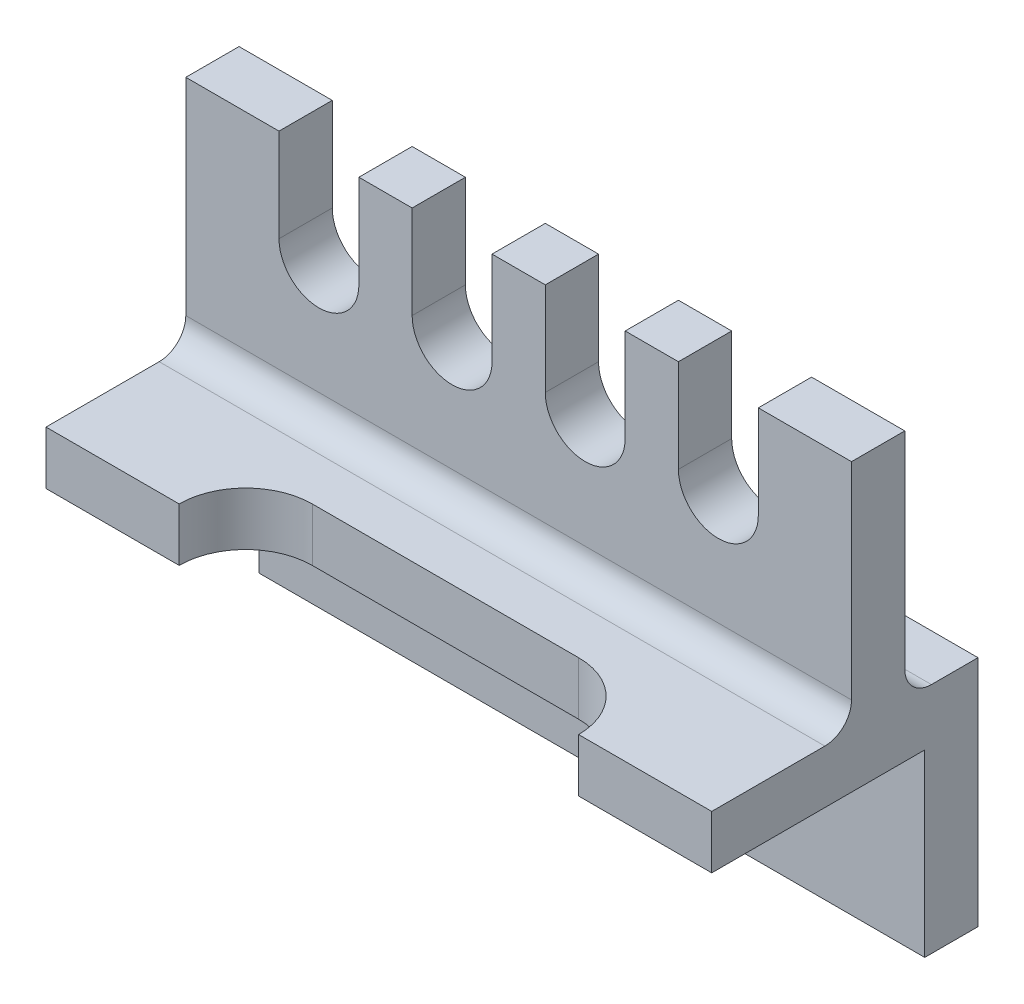
ISO-10303-21;
HEADER;
FILE_DESCRIPTION(('STEP AP214'),'2;1');
FILE_NAME('part.step','',(''),(''),'','','');
FILE_SCHEMA(('AUTOMOTIVE_DESIGN { 1 0 10303 214 1 1 1 1 }'));
ENDSEC;
DATA;
#1=APPLICATION_CONTEXT('core data for automotive mechanical design processes');
#2=APPLICATION_PROTOCOL_DEFINITION('international standard','automotive_design',2000,#1);
#3=PRODUCT_CONTEXT('',#1,'mechanical');
#4=PRODUCT('Part','Part','',(#3));
#5=PRODUCT_RELATED_PRODUCT_CATEGORY('part','',(#4));
#6=PRODUCT_DEFINITION_FORMATION('','',#4);
#7=PRODUCT_DEFINITION_CONTEXT('part definition',#1,'design');
#8=PRODUCT_DEFINITION('design','',#6,#7);
#9=PRODUCT_DEFINITION_SHAPE('','',#8);
#10=(LENGTH_UNIT() NAMED_UNIT(*) SI_UNIT(.MILLI.,.METRE.));
#11=(NAMED_UNIT(*) PLANE_ANGLE_UNIT() SI_UNIT($,.RADIAN.));
#12=(NAMED_UNIT(*) SI_UNIT($,.STERADIAN.) SOLID_ANGLE_UNIT());
#13=UNCERTAINTY_MEASURE_WITH_UNIT(LENGTH_MEASURE(1.E-05),#10,'distance_accuracy_value','');
#14=(GEOMETRIC_REPRESENTATION_CONTEXT(3) GLOBAL_UNCERTAINTY_ASSIGNED_CONTEXT((#13)) GLOBAL_UNIT_ASSIGNED_CONTEXT((#10,
#11,#12)) REPRESENTATION_CONTEXT('',''));
#15=CARTESIAN_POINT('',(0.,0.,0.));
#16=DIRECTION('',(0.,0.,1.));
#17=DIRECTION('',(1.,0.,0.));
#18=AXIS2_PLACEMENT_3D('',#15,#16,#17);
#19=CARTESIAN_POINT('',(100.,27.,40.));
#20=DIRECTION('',(0.,0.,-1.));
#21=DIRECTION('',(-1.,0.,0.));
#22=AXIS2_PLACEMENT_3D('',#19,#20,#21);
#23=PLANE('',#22);
#24=DIRECTION('',(-1.,0.,0.));
#25=VECTOR('',#24,1.);
#26=CARTESIAN_POINT('',(100.,27.,40.));
#27=LINE('',#26,#25);
#28=CARTESIAN_POINT('',(20.,27.,40.));
#29=VERTEX_POINT('',#28);
#30=CARTESIAN_POINT('',(0.,27.,40.));
#31=VERTEX_POINT('',#30);
#32=EDGE_CURVE('E256',#29,#31,#27,.T.);
#33=ORIENTED_EDGE('',*,*,#32,.F.);
#34=DIRECTION('',(0.,1.,0.));
#35=VECTOR('',#34,1.);
#36=CARTESIAN_POINT('',(20.,-0.00100000000004957,40.));
#37=LINE('',#36,#35);
#38=CARTESIAN_POINT('',(20.,35.,40.));
#39=VERTEX_POINT('',#38);
#40=EDGE_CURVE('E242',#29,#39,#37,.T.);
#41=ORIENTED_EDGE('',*,*,#40,.T.);
#42=DIRECTION('',(-1.,0.,0.));
#43=VECTOR('',#42,1.);
#44=CARTESIAN_POINT('',(100.,35.,40.));
#45=LINE('',#44,#43);
#46=CARTESIAN_POINT('',(0.,35.,40.));
#47=VERTEX_POINT('',#46);
#48=EDGE_CURVE('E267',#39,#47,#45,.T.);
#49=ORIENTED_EDGE('',*,*,#48,.T.);
#50=DIRECTION('',(0.,-1.,0.));
#51=VECTOR('',#50,1.);
#52=CARTESIAN_POINT('',(0.,27.,40.));
#53=LINE('',#52,#51);
#54=EDGE_CURVE('E261',#47,#31,#53,.T.);
#55=ORIENTED_EDGE('',*,*,#54,.T.);
#56=EDGE_LOOP('',(#33,#41,#49,#55));
#57=FACE_BOUND('',#56,.T.);
#58=ADVANCED_FACE('F33',(#57),#23,.F.);
#59=CARTESIAN_POINT('',(100.,70.,19.));
#60=DIRECTION('',(0.,-1.,0.));
#61=DIRECTION('',(0.,0.,-1.));
#62=AXIS2_PLACEMENT_3D('',#59,#60,#61);
#63=PLANE('',#62);
#64=DIRECTION('',(-1.,0.,0.));
#65=VECTOR('',#64,1.);
#66=CARTESIAN_POINT('',(100.,70.,19.));
#67=LINE('',#66,#65);
#68=CARTESIAN_POINT('',(74.,70.,19.));
#69=VERTEX_POINT('',#68);
#70=CARTESIAN_POINT('',(66.,70.,19.));
#71=VERTEX_POINT('',#70);
#72=EDGE_CURVE('E319',#69,#71,#67,.T.);
#73=ORIENTED_EDGE('',*,*,#72,.F.);
#74=DIRECTION('',(0.,0.,1.));
#75=VECTOR('',#74,1.);
#76=CARTESIAN_POINT('',(74.,70.,-0.001000000000001));
#77=LINE('',#76,#75);
#78=CARTESIAN_POINT('',(74.,70.,11.));
#79=VERTEX_POINT('',#78);
#80=EDGE_CURVE('E482',#79,#69,#77,.T.);
#81=ORIENTED_EDGE('',*,*,#80,.F.);
#82=DIRECTION('',(-1.,0.,0.));
#83=VECTOR('',#82,1.);
#84=CARTESIAN_POINT('',(100.,70.,11.));
#85=LINE('',#84,#83);
#86=CARTESIAN_POINT('',(66.,70.,11.));
#87=VERTEX_POINT('',#86);
#88=EDGE_CURVE('E325',#79,#87,#85,.T.);
#89=ORIENTED_EDGE('',*,*,#88,.T.);
#90=DIRECTION('',(0.,0.,1.));
#91=VECTOR('',#90,1.);
#92=CARTESIAN_POINT('',(66.,70.,-0.001000000000001));
#93=LINE('',#92,#91);
#94=EDGE_CURVE('E460',#87,#71,#93,.T.);
#95=ORIENTED_EDGE('',*,*,#94,.T.);
#96=EDGE_LOOP('',(#73,#81,#89,#95));
#97=FACE_BOUND('',#96,.T.);
#98=ADVANCED_FACE('F558',(#97),#63,.F.);
#99=CARTESIAN_POINT('',(54.,70.,19.));
#100=VERTEX_POINT('',#99);
#101=CARTESIAN_POINT('',(46.,70.,19.));
#102=VERTEX_POINT('',#101);
#103=EDGE_CURVE('E516',#100,#102,#67,.T.);
#104=ORIENTED_EDGE('',*,*,#103,.F.);
#105=DIRECTION('',(0.,0.,1.));
#106=VECTOR('',#105,1.);
#107=CARTESIAN_POINT('',(54.,70.,-0.001000000000001));
#108=LINE('',#107,#106);
#109=CARTESIAN_POINT('',(54.,70.,11.));
#110=VERTEX_POINT('',#109);
#111=EDGE_CURVE('E458',#110,#100,#108,.T.);
#112=ORIENTED_EDGE('',*,*,#111,.F.);
#113=CARTESIAN_POINT('',(46.,70.,11.));
#114=VERTEX_POINT('',#113);
#115=EDGE_CURVE('E847',#110,#114,#85,.T.);
#116=ORIENTED_EDGE('',*,*,#115,.T.);
#117=DIRECTION('',(0.,0.,1.));
#118=VECTOR('',#117,1.);
#119=CARTESIAN_POINT('',(46.,70.,-0.001000000000001));
#120=LINE('',#119,#118);
#121=EDGE_CURVE('E502',#114,#102,#120,.T.);
#122=ORIENTED_EDGE('',*,*,#121,.T.);
#123=EDGE_LOOP('',(#104,#112,#116,#122));
#124=FACE_BOUND('',#123,.T.);
#125=ADVANCED_FACE('F563',(#124),#63,.F.);
#126=CARTESIAN_POINT('',(14.,70.,19.));
#127=VERTEX_POINT('',#126);
#128=CARTESIAN_POINT('',(0.,70.,19.));
#129=VERTEX_POINT('',#128);
#130=EDGE_CURVE('E320',#127,#129,#67,.T.);
#131=ORIENTED_EDGE('',*,*,#130,.F.);
#132=DIRECTION('',(0.,0.,1.));
#133=VECTOR('',#132,1.);
#134=CARTESIAN_POINT('',(14.,70.,-0.001000000000001));
#135=LINE('',#134,#133);
#136=CARTESIAN_POINT('',(14.,70.,11.));
#137=VERTEX_POINT('',#136);
#138=EDGE_CURVE('E433',#137,#127,#135,.T.);
#139=ORIENTED_EDGE('',*,*,#138,.F.);
#140=CARTESIAN_POINT('',(0.,70.,11.));
#141=VERTEX_POINT('',#140);
#142=EDGE_CURVE('E318',#137,#141,#85,.T.);
#143=ORIENTED_EDGE('',*,*,#142,.T.);
#144=DIRECTION('',(0.,0.,1.));
#145=VECTOR('',#144,1.);
#146=CARTESIAN_POINT('',(0.,70.,19.));
#147=LINE('',#146,#145);
#148=EDGE_CURVE('E311',#141,#129,#147,.T.);
#149=ORIENTED_EDGE('',*,*,#148,.T.);
#150=EDGE_LOOP('',(#131,#139,#143,#149));
#151=FACE_BOUND('',#150,.T.);
#152=ADVANCED_FACE('F529',(#151),#63,.F.);
#153=CARTESIAN_POINT('',(34.,70.,11.));
#154=VERTEX_POINT('',#153);
#155=CARTESIAN_POINT('',(26.,70.,11.));
#156=VERTEX_POINT('',#155);
#157=EDGE_CURVE('E844',#154,#156,#85,.T.);
#158=ORIENTED_EDGE('',*,*,#157,.T.);
#159=DIRECTION('',(0.,0.,1.));
#160=VECTOR('',#159,1.);
#161=CARTESIAN_POINT('',(26.,70.,-0.001000000000001));
#162=LINE('',#161,#160);
#163=CARTESIAN_POINT('',(26.,70.,19.));
#164=VERTEX_POINT('',#163);
#165=EDGE_CURVE('E435',#156,#164,#162,.T.);
#166=ORIENTED_EDGE('',*,*,#165,.T.);
#167=CARTESIAN_POINT('',(34.,70.,19.));
#168=VERTEX_POINT('',#167);
#169=EDGE_CURVE('E519',#168,#164,#67,.T.);
#170=ORIENTED_EDGE('',*,*,#169,.F.);
#171=DIRECTION('',(0.,0.,1.));
#172=VECTOR('',#171,1.);
#173=CARTESIAN_POINT('',(34.,70.,-0.001000000000001));
#174=LINE('',#173,#172);
#175=EDGE_CURVE('E381',#154,#168,#174,.T.);
#176=ORIENTED_EDGE('',*,*,#175,.F.);
#177=EDGE_LOOP('',(#158,#166,#170,#176));
#178=FACE_BOUND('',#177,.T.);
#179=ADVANCED_FACE('F556',(#178),#63,.F.);
#180=CARTESIAN_POINT('',(100.,70.,19.));
#181=DIRECTION('',(0.,0.,-1.));
#182=DIRECTION('',(0.,1.,0.));
#183=AXIS2_PLACEMENT_3D('',#180,#181,#182);
#184=PLANE('',#183);
#185=CARTESIAN_POINT('',(80.,56.,19.));
#186=DIRECTION('',(0.,0.,1.));
#187=DIRECTION('',(1.,0.,0.));
#188=AXIS2_PLACEMENT_3D('',#185,#186,#187);
#189=CIRCLE('',#188,5.99999999999999);
#190=CARTESIAN_POINT('',(74.,56.,19.));
#191=VERTEX_POINT('',#190);
#192=CARTESIAN_POINT('',(86.,56.,19.));
#193=VERTEX_POINT('',#192);
#194=EDGE_CURVE('E471',#191,#193,#189,.T.);
#195=ORIENTED_EDGE('',*,*,#194,.F.);
#196=DIRECTION('',(0.,-1.,0.));
#197=VECTOR('',#196,1.);
#198=CARTESIAN_POINT('',(74.,56.,19.));
#199=LINE('',#198,#197);
#200=EDGE_CURVE('E476',#69,#191,#199,.T.);
#201=ORIENTED_EDGE('',*,*,#200,.F.);
#202=ORIENTED_EDGE('',*,*,#72,.T.);
#203=DIRECTION('',(0.,1.,0.));
#204=VECTOR('',#203,1.);
#205=CARTESIAN_POINT('',(66.,56.,19.));
#206=LINE('',#205,#204);
#207=CARTESIAN_POINT('',(66.,56.,19.));
#208=VERTEX_POINT('',#207);
#209=EDGE_CURVE('E450',#208,#71,#206,.T.);
#210=ORIENTED_EDGE('',*,*,#209,.F.);
#211=CARTESIAN_POINT('',(60.,56.,19.));
#212=DIRECTION('',(0.,0.,1.));
#213=DIRECTION('',(1.,0.,0.));
#214=AXIS2_PLACEMENT_3D('',#211,#212,#213);
#215=CIRCLE('',#214,6.);
#216=CARTESIAN_POINT('',(54.,56.,19.));
#217=VERTEX_POINT('',#216);
#218=EDGE_CURVE('E447',#217,#208,#215,.T.);
#219=ORIENTED_EDGE('',*,*,#218,.F.);
#220=DIRECTION('',(0.,-1.,0.));
#221=VECTOR('',#220,1.);
#222=CARTESIAN_POINT('',(54.,56.,19.));
#223=LINE('',#222,#221);
#224=EDGE_CURVE('E452',#100,#217,#223,.T.);
#225=ORIENTED_EDGE('',*,*,#224,.F.);
#226=ORIENTED_EDGE('',*,*,#103,.T.);
#227=DIRECTION('',(0.,1.,0.));
#228=VECTOR('',#227,1.);
#229=CARTESIAN_POINT('',(46.,56.,19.));
#230=LINE('',#229,#228);
#231=CARTESIAN_POINT('',(46.,56.,19.));
#232=VERTEX_POINT('',#231);
#233=EDGE_CURVE('E497',#232,#102,#230,.T.);
#234=ORIENTED_EDGE('',*,*,#233,.F.);
#235=CARTESIAN_POINT('',(40.,56.,19.));
#236=DIRECTION('',(0.,0.,1.));
#237=DIRECTION('',(1.,0.,0.));
#238=AXIS2_PLACEMENT_3D('',#235,#236,#237);
#239=CIRCLE('',#238,6.);
#240=CARTESIAN_POINT('',(34.,56.,19.));
#241=VERTEX_POINT('',#240);
#242=EDGE_CURVE('E494',#241,#232,#239,.T.);
#243=ORIENTED_EDGE('',*,*,#242,.F.);
#244=DIRECTION('',(0.,-1.,0.));
#245=VECTOR('',#244,1.);
#246=CARTESIAN_POINT('',(34.,56.,19.));
#247=LINE('',#246,#245);
#248=EDGE_CURVE('E499',#168,#241,#247,.T.);
#249=ORIENTED_EDGE('',*,*,#248,.F.);
#250=ORIENTED_EDGE('',*,*,#169,.T.);
#251=DIRECTION('',(0.,1.,0.));
#252=VECTOR('',#251,1.);
#253=CARTESIAN_POINT('',(26.,56.,19.));
#254=LINE('',#253,#252);
#255=CARTESIAN_POINT('',(26.,56.,19.));
#256=VERTEX_POINT('',#255);
#257=EDGE_CURVE('E56',#256,#164,#254,.T.);
#258=ORIENTED_EDGE('',*,*,#257,.F.);
#259=CARTESIAN_POINT('',(20.,56.,19.));
#260=DIRECTION('',(0.,0.,1.));
#261=DIRECTION('',(1.,0.,0.));
#262=AXIS2_PLACEMENT_3D('',#259,#260,#261);
#263=CIRCLE('',#262,6.00000000000001);
#264=CARTESIAN_POINT('',(14.,56.,19.));
#265=VERTEX_POINT('',#264);
#266=EDGE_CURVE('E422',#265,#256,#263,.T.);
#267=ORIENTED_EDGE('',*,*,#266,.F.);
#268=DIRECTION('',(0.,-1.,0.));
#269=VECTOR('',#268,1.);
#270=CARTESIAN_POINT('',(14.,56.,19.));
#271=LINE('',#270,#269);
#272=EDGE_CURVE('E426',#127,#265,#271,.T.);
#273=ORIENTED_EDGE('',*,*,#272,.F.);
#274=ORIENTED_EDGE('',*,*,#130,.T.);
#275=DIRECTION('',(0.,-1.,0.));
#276=VECTOR('',#275,1.);
#277=CARTESIAN_POINT('',(0.,70.,19.));
#278=LINE('',#277,#276);
#279=CARTESIAN_POINT('',(0.,39.,19.));
#280=VERTEX_POINT('',#279);
#281=EDGE_CURVE('E293',#129,#280,#278,.T.);
#282=ORIENTED_EDGE('',*,*,#281,.T.);
#283=DIRECTION('',(-1.,0.,0.));
#284=VECTOR('',#283,1.);
#285=CARTESIAN_POINT('',(100.,39.,19.));
#286=LINE('',#285,#284);
#287=CARTESIAN_POINT('',(100.,39.,19.));
#288=VERTEX_POINT('',#287);
#289=EDGE_CURVE('E11',#288,#280,#286,.T.);
#290=ORIENTED_EDGE('',*,*,#289,.F.);
#291=DIRECTION('',(0.,-1.,0.));
#292=VECTOR('',#291,1.);
#293=CARTESIAN_POINT('',(100.,70.,19.));
#294=LINE('',#293,#292);
#295=CARTESIAN_POINT('',(100.,70.,19.));
#296=VERTEX_POINT('',#295);
#297=EDGE_CURVE('E314',#296,#288,#294,.T.);
#298=ORIENTED_EDGE('',*,*,#297,.F.);
#299=CARTESIAN_POINT('',(86.,70.,19.));
#300=VERTEX_POINT('',#299);
#301=EDGE_CURVE('E315',#296,#300,#67,.T.);
#302=ORIENTED_EDGE('',*,*,#301,.T.);
#303=DIRECTION('',(0.,1.,0.));
#304=VECTOR('',#303,1.);
#305=CARTESIAN_POINT('',(86.,56.,19.));
#306=LINE('',#305,#304);
#307=EDGE_CURVE('E474',#193,#300,#306,.T.);
#308=ORIENTED_EDGE('',*,*,#307,.F.);
#309=EDGE_LOOP('',(#195,#201,#202,#210,#219,#225,#226,#234,#243,#249,#250,#258,#267,#273,#274,
#282,#290,#298,#302,#308));
#310=FACE_BOUND('',#309,.T.);
#311=ADVANCED_FACE('F35',(#310),#184,.F.);
#312=CARTESIAN_POINT('',(100.,39.,23.));
#313=DIRECTION('',(-1.,0.,0.));
#314=DIRECTION('',(0.,0.,1.));
#315=AXIS2_PLACEMENT_3D('',#312,#313,#314);
#316=CYLINDRICAL_SURFACE('',#315,4.);
#317=CARTESIAN_POINT('',(0.,39.,23.));
#318=DIRECTION('',(-1.,0.,0.));
#319=DIRECTION('',(0.,0.,-1.));
#320=AXIS2_PLACEMENT_3D('',#317,#318,#319);
#321=CIRCLE('',#320,4.);
#322=CARTESIAN_POINT('',(0.,35.,23.));
#323=VERTEX_POINT('',#322);
#324=EDGE_CURVE('E289',#280,#323,#321,.T.);
#325=ORIENTED_EDGE('',*,*,#324,.T.);
#326=DIRECTION('',(-1.,0.,0.));
#327=VECTOR('',#326,1.);
#328=CARTESIAN_POINT('',(100.,35.,23.));
#329=LINE('',#328,#327);
#330=CARTESIAN_POINT('',(100.,35.,23.));
#331=VERTEX_POINT('',#330);
#332=EDGE_CURVE('E41',#331,#323,#329,.T.);
#333=ORIENTED_EDGE('',*,*,#332,.F.);
#334=CARTESIAN_POINT('',(100.,39.,23.));
#335=DIRECTION('',(-1.,0.,0.));
#336=DIRECTION('',(0.,0.,-1.));
#337=AXIS2_PLACEMENT_3D('',#334,#335,#336);
#338=CIRCLE('',#337,4.);
#339=EDGE_CURVE('E389',#288,#331,#338,.T.);
#340=ORIENTED_EDGE('',*,*,#339,.F.);
#341=ORIENTED_EDGE('',*,*,#289,.T.);
#342=EDGE_LOOP('',(#325,#333,#340,#341));
#343=FACE_BOUND('',#342,.T.);
#344=ADVANCED_FACE('F549',(#343),#316,.F.);
#345=CARTESIAN_POINT('',(100.,35.,40.));
#346=DIRECTION('',(0.,-1.,0.));
#347=DIRECTION('',(0.,0.,-1.));
#348=AXIS2_PLACEMENT_3D('',#345,#346,#347);
#349=PLANE('',#348);
#350=ORIENTED_EDGE('',*,*,#48,.F.);
#351=CARTESIAN_POINT('',(30.,35.,40.));
#352=DIRECTION('',(0.,1.,0.));
#353=DIRECTION('',(0.,0.,1.));
#354=AXIS2_PLACEMENT_3D('',#351,#352,#353);
#355=CIRCLE('',#354,10.);
#356=CARTESIAN_POINT('',(30.,35.,30.));
#357=VERTEX_POINT('',#356);
#358=EDGE_CURVE('E247',#357,#39,#355,.T.);
#359=ORIENTED_EDGE('',*,*,#358,.F.);
#360=DIRECTION('',(-1.,0.,0.));
#361=VECTOR('',#360,1.);
#362=CARTESIAN_POINT('',(30.,35.,30.));
#363=LINE('',#362,#361);
#364=CARTESIAN_POINT('',(70.,35.,30.));
#365=VERTEX_POINT('',#364);
#366=EDGE_CURVE('E252',#365,#357,#363,.T.);
#367=ORIENTED_EDGE('',*,*,#366,.F.);
#368=CARTESIAN_POINT('',(70.,35.,40.));
#369=DIRECTION('',(0.,1.,0.));
#370=DIRECTION('',(0.,0.,1.));
#371=AXIS2_PLACEMENT_3D('',#368,#369,#370);
#372=CIRCLE('',#371,10.);
#373=CARTESIAN_POINT('',(80.,35.,40.));
#374=VERTEX_POINT('',#373);
#375=EDGE_CURVE('E863',#374,#365,#372,.T.);
#376=ORIENTED_EDGE('',*,*,#375,.F.);
#377=CARTESIAN_POINT('',(100.,35.,40.));
#378=VERTEX_POINT('',#377);
#379=EDGE_CURVE('E273',#378,#374,#45,.T.);
#380=ORIENTED_EDGE('',*,*,#379,.F.);
#381=DIRECTION('',(0.,0.,1.));
#382=VECTOR('',#381,1.);
#383=CARTESIAN_POINT('',(100.,35.,40.));
#384=LINE('',#383,#382);
#385=EDGE_CURVE('E284',#331,#378,#384,.T.);
#386=ORIENTED_EDGE('',*,*,#385,.F.);
#387=ORIENTED_EDGE('',*,*,#332,.T.);
#388=DIRECTION('',(0.,0.,1.));
#389=VECTOR('',#388,1.);
#390=CARTESIAN_POINT('',(0.,35.,40.));
#391=LINE('',#390,#389);
#392=EDGE_CURVE('E282',#323,#47,#391,.T.);
#393=ORIENTED_EDGE('',*,*,#392,.T.);
#394=EDGE_LOOP('',(#350,#359,#367,#376,#380,#386,#387,#393));
#395=FACE_BOUND('',#394,.T.);
#396=ADVANCED_FACE('F281',(#395),#349,.F.);
#397=ORIENTED_EDGE('',*,*,#379,.T.);
#398=DIRECTION('',(0.,1.,0.));
#399=VECTOR('',#398,1.);
#400=CARTESIAN_POINT('',(80.,-0.00100000000004957,40.));
#401=LINE('',#400,#399);
#402=CARTESIAN_POINT('',(80.,27.,40.));
#403=VERTEX_POINT('',#402);
#404=EDGE_CURVE('E251',#403,#374,#401,.T.);
#405=ORIENTED_EDGE('',*,*,#404,.F.);
#406=CARTESIAN_POINT('',(100.,27.,40.));
#407=VERTEX_POINT('',#406);
#408=EDGE_CURVE('E263',#407,#403,#27,.T.);
#409=ORIENTED_EDGE('',*,*,#408,.F.);
#410=DIRECTION('',(0.,-1.,0.));
#411=VECTOR('',#410,1.);
#412=CARTESIAN_POINT('',(100.,27.,40.));
#413=LINE('',#412,#411);
#414=EDGE_CURVE('E392',#378,#407,#413,.T.);
#415=ORIENTED_EDGE('',*,*,#414,.F.);
#416=EDGE_LOOP('',(#397,#405,#409,#415));
#417=FACE_BOUND('',#416,.T.);
#418=ADVANCED_FACE('F406',(#417),#23,.F.);
#419=CARTESIAN_POINT('',(100.,27.,8.));
#420=DIRECTION('',(0.,1.,0.));
#421=DIRECTION('',(0.,0.,1.));
#422=AXIS2_PLACEMENT_3D('',#419,#420,#421);
#423=PLANE('',#422);
#424=DIRECTION('',(1.,0.,0.));
#425=VECTOR('',#424,1.);
#426=CARTESIAN_POINT('',(30.,27.,30.));
#427=LINE('',#426,#425);
#428=CARTESIAN_POINT('',(30.,27.,30.));
#429=VERTEX_POINT('',#428);
#430=CARTESIAN_POINT('',(70.,27.,30.));
#431=VERTEX_POINT('',#430);
#432=EDGE_CURVE('E48',#429,#431,#427,.T.);
#433=ORIENTED_EDGE('',*,*,#432,.F.);
#434=CARTESIAN_POINT('',(30.,27.,40.));
#435=DIRECTION('',(0.,1.,0.));
#436=DIRECTION('',(0.,0.,1.));
#437=AXIS2_PLACEMENT_3D('',#434,#435,#436);
#438=CIRCLE('',#437,10.);
#439=EDGE_CURVE('E245',#29,#429,#438,.F.);
#440=ORIENTED_EDGE('',*,*,#439,.F.);
#441=ORIENTED_EDGE('',*,*,#32,.T.);
#442=DIRECTION('',(0.,0.,-1.));
#443=VECTOR('',#442,1.);
#444=CARTESIAN_POINT('',(0.,27.,8.));
#445=LINE('',#444,#443);
#446=CARTESIAN_POINT('',(0.,27.,8.));
#447=VERTEX_POINT('',#446);
#448=EDGE_CURVE('E291',#31,#447,#445,.T.);
#449=ORIENTED_EDGE('',*,*,#448,.T.);
#450=DIRECTION('',(-1.,0.,0.));
#451=VECTOR('',#450,1.);
#452=CARTESIAN_POINT('',(100.,27.,8.));
#453=LINE('',#452,#451);
#454=CARTESIAN_POINT('',(100.,27.,8.));
#455=VERTEX_POINT('',#454);
#456=EDGE_CURVE('E264',#455,#447,#453,.T.);
#457=ORIENTED_EDGE('',*,*,#456,.F.);
#458=DIRECTION('',(0.,0.,-1.));
#459=VECTOR('',#458,1.);
#460=CARTESIAN_POINT('',(100.,27.,8.));
#461=LINE('',#460,#459);
#462=EDGE_CURVE('E394',#407,#455,#461,.T.);
#463=ORIENTED_EDGE('',*,*,#462,.F.);
#464=ORIENTED_EDGE('',*,*,#408,.T.);
#465=CARTESIAN_POINT('',(70.,27.,40.));
#466=DIRECTION('',(0.,1.,0.));
#467=DIRECTION('',(0.,0.,1.));
#468=AXIS2_PLACEMENT_3D('',#465,#466,#467);
#469=CIRCLE('',#468,10.);
#470=EDGE_CURVE('E402',#431,#403,#469,.F.);
#471=ORIENTED_EDGE('',*,*,#470,.F.);
#472=EDGE_LOOP('',(#433,#440,#441,#449,#457,#463,#464,#471));
#473=FACE_BOUND('',#472,.T.);
#474=ADVANCED_FACE('F255',(#473),#423,.F.);
#475=CARTESIAN_POINT('',(100.,0.,8.));
#476=DIRECTION('',(0.,0.,-1.));
#477=DIRECTION('',(-1.,0.,0.));
#478=AXIS2_PLACEMENT_3D('',#475,#476,#477);
#479=PLANE('',#478);
#480=DIRECTION('',(0.,-1.,0.));
#481=VECTOR('',#480,1.);
#482=CARTESIAN_POINT('',(0.,0.,8.));
#483=LINE('',#482,#481);
#484=CARTESIAN_POINT('',(0.,0.,8.));
#485=VERTEX_POINT('',#484);
#486=EDGE_CURVE('E298',#447,#485,#483,.T.);
#487=ORIENTED_EDGE('',*,*,#486,.T.);
#488=DIRECTION('',(-1.,0.,0.));
#489=VECTOR('',#488,1.);
#490=CARTESIAN_POINT('',(100.,0.,8.));
#491=LINE('',#490,#489);
#492=CARTESIAN_POINT('',(100.,0.,8.));
#493=VERTEX_POINT('',#492);
#494=EDGE_CURVE('E269',#493,#485,#491,.T.);
#495=ORIENTED_EDGE('',*,*,#494,.F.);
#496=DIRECTION('',(0.,-1.,0.));
#497=VECTOR('',#496,1.);
#498=CARTESIAN_POINT('',(100.,0.,8.));
#499=LINE('',#498,#497);
#500=EDGE_CURVE('E396',#455,#493,#499,.T.);
#501=ORIENTED_EDGE('',*,*,#500,.F.);
#502=ORIENTED_EDGE('',*,*,#456,.T.);
#503=EDGE_LOOP('',(#487,#495,#501,#502));
#504=FACE_BOUND('',#503,.T.);
#505=ADVANCED_FACE('F400',(#504),#479,.F.);
#506=CARTESIAN_POINT('',(100.,0.,0.));
#507=DIRECTION('',(0.,1.,0.));
#508=DIRECTION('',(0.,0.,1.));
#509=AXIS2_PLACEMENT_3D('',#506,#507,#508);
#510=PLANE('',#509);
#511=DIRECTION('',(0.,0.,-1.));
#512=VECTOR('',#511,1.);
#513=CARTESIAN_POINT('',(0.,0.,0.));
#514=LINE('',#513,#512);
#515=CARTESIAN_POINT('',(0.,0.,0.));
#516=VERTEX_POINT('',#515);
#517=EDGE_CURVE('E300',#485,#516,#514,.T.);
#518=ORIENTED_EDGE('',*,*,#517,.T.);
#519=DIRECTION('',(-1.,0.,0.));
#520=VECTOR('',#519,1.);
#521=CARTESIAN_POINT('',(100.,0.,0.));
#522=LINE('',#521,#520);
#523=CARTESIAN_POINT('',(100.,0.,0.));
#524=VERTEX_POINT('',#523);
#525=EDGE_CURVE('E334',#524,#516,#522,.T.);
#526=ORIENTED_EDGE('',*,*,#525,.F.);
#527=DIRECTION('',(0.,0.,-1.));
#528=VECTOR('',#527,1.);
#529=CARTESIAN_POINT('',(100.,0.,0.));
#530=LINE('',#529,#528);
#531=EDGE_CURVE('E343',#493,#524,#530,.T.);
#532=ORIENTED_EDGE('',*,*,#531,.F.);
#533=ORIENTED_EDGE('',*,*,#494,.T.);
#534=EDGE_LOOP('',(#518,#526,#532,#533));
#535=FACE_BOUND('',#534,.T.);
#536=ADVANCED_FACE('F341',(#535),#510,.F.);
#537=CARTESIAN_POINT('',(100.,35.,0.));
#538=DIRECTION('',(0.,0.,1.));
#539=DIRECTION('',(1.,0.,0.));
#540=AXIS2_PLACEMENT_3D('',#537,#538,#539);
#541=PLANE('',#540);
#542=DIRECTION('',(0.,1.,0.));
#543=VECTOR('',#542,1.);
#544=CARTESIAN_POINT('',(0.,35.,0.));
#545=LINE('',#544,#543);
#546=CARTESIAN_POINT('',(0.,35.,0.));
#547=VERTEX_POINT('',#546);
#548=EDGE_CURVE('E302',#516,#547,#545,.T.);
#549=ORIENTED_EDGE('',*,*,#548,.T.);
#550=DIRECTION('',(-1.,0.,0.));
#551=VECTOR('',#550,1.);
#552=CARTESIAN_POINT('',(100.,35.,0.));
#553=LINE('',#552,#551);
#554=CARTESIAN_POINT('',(100.,35.,0.));
#555=VERTEX_POINT('',#554);
#556=EDGE_CURVE('E331',#555,#547,#553,.T.);
#557=ORIENTED_EDGE('',*,*,#556,.F.);
#558=DIRECTION('',(0.,1.,0.));
#559=VECTOR('',#558,1.);
#560=CARTESIAN_POINT('',(100.,35.,0.));
#561=LINE('',#560,#559);
#562=EDGE_CURVE('E362',#524,#555,#561,.T.);
#563=ORIENTED_EDGE('',*,*,#562,.F.);
#564=ORIENTED_EDGE('',*,*,#525,.T.);
#565=EDGE_LOOP('',(#549,#557,#563,#564));
#566=FACE_BOUND('',#565,.T.);
#567=ADVANCED_FACE('F352',(#566),#541,.F.);
#568=CARTESIAN_POINT('',(100.,35.,7.));
#569=DIRECTION('',(0.,-1.,0.));
#570=DIRECTION('',(0.,0.,-1.));
#571=AXIS2_PLACEMENT_3D('',#568,#569,#570);
#572=PLANE('',#571);
#573=DIRECTION('',(0.,0.,1.));
#574=VECTOR('',#573,1.);
#575=CARTESIAN_POINT('',(0.,35.,7.));
#576=LINE('',#575,#574);
#577=CARTESIAN_POINT('',(0.,35.,7.));
#578=VERTEX_POINT('',#577);
#579=EDGE_CURVE('E304',#547,#578,#576,.T.);
#580=ORIENTED_EDGE('',*,*,#579,.T.);
#581=DIRECTION('',(-1.,0.,0.));
#582=VECTOR('',#581,1.);
#583=CARTESIAN_POINT('',(100.,35.,7.));
#584=LINE('',#583,#582);
#585=CARTESIAN_POINT('',(100.,35.,7.));
#586=VERTEX_POINT('',#585);
#587=EDGE_CURVE('E328',#586,#578,#584,.T.);
#588=ORIENTED_EDGE('',*,*,#587,.F.);
#589=DIRECTION('',(0.,0.,1.));
#590=VECTOR('',#589,1.);
#591=CARTESIAN_POINT('',(100.,35.,7.));
#592=LINE('',#591,#590);
#593=EDGE_CURVE('E358',#555,#586,#592,.T.);
#594=ORIENTED_EDGE('',*,*,#593,.F.);
#595=ORIENTED_EDGE('',*,*,#556,.T.);
#596=EDGE_LOOP('',(#580,#588,#594,#595));
#597=FACE_BOUND('',#596,.T.);
#598=ADVANCED_FACE('F356',(#597),#572,.F.);
#599=CARTESIAN_POINT('',(100.,39.,7.));
#600=DIRECTION('',(-1.,0.,0.));
#601=DIRECTION('',(0.,0.,1.));
#602=AXIS2_PLACEMENT_3D('',#599,#600,#601);
#603=CYLINDRICAL_SURFACE('',#602,4.);
#604=CARTESIAN_POINT('',(0.,39.,7.));
#605=DIRECTION('',(-1.,0.,0.));
#606=DIRECTION('',(0.,0.,-1.));
#607=AXIS2_PLACEMENT_3D('',#604,#605,#606);
#608=CIRCLE('',#607,4.);
#609=CARTESIAN_POINT('',(0.,39.,11.));
#610=VERTEX_POINT('',#609);
#611=EDGE_CURVE('E306',#578,#610,#608,.T.);
#612=ORIENTED_EDGE('',*,*,#611,.T.);
#613=DIRECTION('',(-1.,0.,0.));
#614=VECTOR('',#613,1.);
#615=CARTESIAN_POINT('',(100.,39.,11.));
#616=LINE('',#615,#614);
#617=CARTESIAN_POINT('',(100.,39.,11.));
#618=VERTEX_POINT('',#617);
#619=EDGE_CURVE('E324',#618,#610,#616,.T.);
#620=ORIENTED_EDGE('',*,*,#619,.F.);
#621=CARTESIAN_POINT('',(100.,39.,7.));
#622=DIRECTION('',(-1.,0.,0.));
#623=DIRECTION('',(0.,0.,-1.));
#624=AXIS2_PLACEMENT_3D('',#621,#622,#623);
#625=CIRCLE('',#624,4.);
#626=EDGE_CURVE('E361',#586,#618,#625,.T.);
#627=ORIENTED_EDGE('',*,*,#626,.F.);
#628=ORIENTED_EDGE('',*,*,#587,.T.);
#629=EDGE_LOOP('',(#612,#620,#627,#628));
#630=FACE_BOUND('',#629,.T.);
#631=ADVANCED_FACE('F540',(#630),#603,.F.);
#632=CARTESIAN_POINT('',(100.,70.,11.));
#633=DIRECTION('',(0.,0.,1.));
#634=DIRECTION('',(0.,-1.,0.));
#635=AXIS2_PLACEMENT_3D('',#632,#633,#634);
#636=PLANE('',#635);
#637=ORIENTED_EDGE('',*,*,#88,.F.);
#638=DIRECTION('',(0.,1.,0.));
#639=VECTOR('',#638,1.);
#640=CARTESIAN_POINT('',(74.,56.,11.));
#641=LINE('',#640,#639);
#642=CARTESIAN_POINT('',(74.,56.,11.));
#643=VERTEX_POINT('',#642);
#644=EDGE_CURVE('E469',#643,#79,#641,.T.);
#645=ORIENTED_EDGE('',*,*,#644,.F.);
#646=CARTESIAN_POINT('',(80.,56.,11.));
#647=DIRECTION('',(0.,0.,1.));
#648=DIRECTION('',(0.,-1.,0.));
#649=AXIS2_PLACEMENT_3D('',#646,#647,#648);
#650=CIRCLE('',#649,5.99999999999999);
#651=CARTESIAN_POINT('',(86.,56.,11.));
#652=VERTEX_POINT('',#651);
#653=EDGE_CURVE('E466',#652,#643,#650,.F.);
#654=ORIENTED_EDGE('',*,*,#653,.F.);
#655=DIRECTION('',(0.,-1.,0.));
#656=VECTOR('',#655,1.);
#657=CARTESIAN_POINT('',(86.,56.,11.));
#658=LINE('',#657,#656);
#659=CARTESIAN_POINT('',(86.,70.,11.));
#660=VERTEX_POINT('',#659);
#661=EDGE_CURVE('E445',#660,#652,#658,.T.);
#662=ORIENTED_EDGE('',*,*,#661,.F.);
#663=CARTESIAN_POINT('',(100.,70.,11.));
#664=VERTEX_POINT('',#663);
#665=EDGE_CURVE('E321',#664,#660,#85,.T.);
#666=ORIENTED_EDGE('',*,*,#665,.F.);
#667=DIRECTION('',(0.,1.,0.));
#668=VECTOR('',#667,1.);
#669=CARTESIAN_POINT('',(100.,70.,11.));
#670=LINE('',#669,#668);
#671=EDGE_CURVE('E364',#618,#664,#670,.T.);
#672=ORIENTED_EDGE('',*,*,#671,.F.);
#673=ORIENTED_EDGE('',*,*,#619,.T.);
#674=DIRECTION('',(0.,1.,0.));
#675=VECTOR('',#674,1.);
#676=CARTESIAN_POINT('',(0.,70.,11.));
#677=LINE('',#676,#675);
#678=EDGE_CURVE('E308',#610,#141,#677,.T.);
#679=ORIENTED_EDGE('',*,*,#678,.T.);
#680=ORIENTED_EDGE('',*,*,#142,.F.);
#681=DIRECTION('',(0.,1.,0.));
#682=VECTOR('',#681,1.);
#683=CARTESIAN_POINT('',(14.,56.,11.));
#684=LINE('',#683,#682);
#685=CARTESIAN_POINT('',(14.,56.,11.));
#686=VERTEX_POINT('',#685);
#687=EDGE_CURVE('E419',#686,#137,#684,.T.);
#688=ORIENTED_EDGE('',*,*,#687,.F.);
#689=CARTESIAN_POINT('',(20.,56.,11.));
#690=DIRECTION('',(0.,0.,1.));
#691=DIRECTION('',(0.,-1.,0.));
#692=AXIS2_PLACEMENT_3D('',#689,#690,#691);
#693=CIRCLE('',#692,6.00000000000001);
#694=CARTESIAN_POINT('',(26.,56.,11.));
#695=VERTEX_POINT('',#694);
#696=EDGE_CURVE('E416',#695,#686,#693,.F.);
#697=ORIENTED_EDGE('',*,*,#696,.F.);
#698=DIRECTION('',(0.,-1.,0.));
#699=VECTOR('',#698,1.);
#700=CARTESIAN_POINT('',(26.,56.,11.));
#701=LINE('',#700,#699);
#702=EDGE_CURVE('E432',#156,#695,#701,.T.);
#703=ORIENTED_EDGE('',*,*,#702,.F.);
#704=ORIENTED_EDGE('',*,*,#157,.F.);
#705=DIRECTION('',(0.,1.,0.));
#706=VECTOR('',#705,1.);
#707=CARTESIAN_POINT('',(34.,56.,11.));
#708=LINE('',#707,#706);
#709=CARTESIAN_POINT('',(34.,56.,11.));
#710=VERTEX_POINT('',#709);
#711=EDGE_CURVE('E492',#710,#154,#708,.T.);
#712=ORIENTED_EDGE('',*,*,#711,.F.);
#713=CARTESIAN_POINT('',(40.,56.,11.));
#714=DIRECTION('',(0.,0.,1.));
#715=DIRECTION('',(0.,-1.,0.));
#716=AXIS2_PLACEMENT_3D('',#713,#714,#715);
#717=CIRCLE('',#716,6.);
#718=CARTESIAN_POINT('',(46.,56.,11.));
#719=VERTEX_POINT('',#718);
#720=EDGE_CURVE('E440',#719,#710,#717,.F.);
#721=ORIENTED_EDGE('',*,*,#720,.F.);
#722=DIRECTION('',(0.,-1.,0.));
#723=VECTOR('',#722,1.);
#724=CARTESIAN_POINT('',(46.,56.,11.));
#725=LINE('',#724,#723);
#726=EDGE_CURVE('E372',#114,#719,#725,.T.);
#727=ORIENTED_EDGE('',*,*,#726,.F.);
#728=ORIENTED_EDGE('',*,*,#115,.F.);
#729=DIRECTION('',(0.,1.,0.));
#730=VECTOR('',#729,1.);
#731=CARTESIAN_POINT('',(54.,56.,11.));
#732=LINE('',#731,#730);
#733=CARTESIAN_POINT('',(54.,56.,11.));
#734=VERTEX_POINT('',#733);
#735=EDGE_CURVE('E444',#734,#110,#732,.T.);
#736=ORIENTED_EDGE('',*,*,#735,.F.);
#737=CARTESIAN_POINT('',(60.,56.,11.));
#738=DIRECTION('',(0.,0.,1.));
#739=DIRECTION('',(0.,-1.,0.));
#740=AXIS2_PLACEMENT_3D('',#737,#738,#739);
#741=CIRCLE('',#740,6.);
#742=CARTESIAN_POINT('',(66.,56.,11.));
#743=VERTEX_POINT('',#742);
#744=EDGE_CURVE('E441',#743,#734,#741,.F.);
#745=ORIENTED_EDGE('',*,*,#744,.F.);
#746=DIRECTION('',(0.,-1.,0.));
#747=VECTOR('',#746,1.);
#748=CARTESIAN_POINT('',(66.,56.,11.));
#749=LINE('',#748,#747);
#750=EDGE_CURVE('E420',#87,#743,#749,.T.);
#751=ORIENTED_EDGE('',*,*,#750,.F.);
#752=EDGE_LOOP('',(#637,#645,#654,#662,#666,#672,#673,#679,#680,#688,#697,#703,#704,#712,#721,
#727,#728,#736,#745,#751));
#753=FACE_BOUND('',#752,.T.);
#754=ADVANCED_FACE('F534',(#753),#636,.F.);
#755=ORIENTED_EDGE('',*,*,#665,.T.);
#756=DIRECTION('',(0.,0.,1.));
#757=VECTOR('',#756,1.);
#758=CARTESIAN_POINT('',(86.,70.,-0.001000000000001));
#759=LINE('',#758,#757);
#760=EDGE_CURVE('E484',#660,#300,#759,.T.);
#761=ORIENTED_EDGE('',*,*,#760,.T.);
#762=ORIENTED_EDGE('',*,*,#301,.F.);
#763=DIRECTION('',(0.,0.,1.));
#764=VECTOR('',#763,1.);
#765=CARTESIAN_POINT('',(100.,70.,19.));
#766=LINE('',#765,#764);
#767=EDGE_CURVE('E370',#664,#296,#766,.T.);
#768=ORIENTED_EDGE('',*,*,#767,.F.);
#769=EDGE_LOOP('',(#755,#761,#762,#768));
#770=FACE_BOUND('',#769,.T.);
#771=ADVANCED_FACE('F546',(#770),#63,.F.);
#772=CARTESIAN_POINT('',(100.,39.,23.));
#773=DIRECTION('',(1.,0.,0.));
#774=DIRECTION('',(0.,0.,-1.));
#775=AXIS2_PLACEMENT_3D('',#772,#773,#774);
#776=PLANE('',#775);
#777=ORIENTED_EDGE('',*,*,#297,.T.);
#778=ORIENTED_EDGE('',*,*,#339,.T.);
#779=ORIENTED_EDGE('',*,*,#385,.T.);
#780=ORIENTED_EDGE('',*,*,#414,.T.);
#781=ORIENTED_EDGE('',*,*,#462,.T.);
#782=ORIENTED_EDGE('',*,*,#500,.T.);
#783=ORIENTED_EDGE('',*,*,#531,.T.);
#784=ORIENTED_EDGE('',*,*,#562,.T.);
#785=ORIENTED_EDGE('',*,*,#593,.T.);
#786=ORIENTED_EDGE('',*,*,#626,.T.);
#787=ORIENTED_EDGE('',*,*,#671,.T.);
#788=ORIENTED_EDGE('',*,*,#767,.T.);
#789=EDGE_LOOP('',(#777,#778,#779,#780,#781,#782,#783,#784,#785,#786,#787,#788));
#790=FACE_BOUND('',#789,.T.);
#791=ADVANCED_FACE('F397',(#790),#776,.T.);
#792=CARTESIAN_POINT('',(0.,39.,23.));
#793=DIRECTION('',(1.,0.,0.));
#794=DIRECTION('',(0.,0.,-1.));
#795=AXIS2_PLACEMENT_3D('',#792,#793,#794);
#796=PLANE('',#795);
#797=ORIENTED_EDGE('',*,*,#281,.F.);
#798=ORIENTED_EDGE('',*,*,#148,.F.);
#799=ORIENTED_EDGE('',*,*,#678,.F.);
#800=ORIENTED_EDGE('',*,*,#611,.F.);
#801=ORIENTED_EDGE('',*,*,#579,.F.);
#802=ORIENTED_EDGE('',*,*,#548,.F.);
#803=ORIENTED_EDGE('',*,*,#517,.F.);
#804=ORIENTED_EDGE('',*,*,#486,.F.);
#805=ORIENTED_EDGE('',*,*,#448,.F.);
#806=ORIENTED_EDGE('',*,*,#54,.F.);
#807=ORIENTED_EDGE('',*,*,#392,.F.);
#808=ORIENTED_EDGE('',*,*,#324,.F.);
#809=EDGE_LOOP('',(#797,#798,#799,#800,#801,#802,#803,#804,#805,#806,#807,#808));
#810=FACE_BOUND('',#809,.T.);
#811=ADVANCED_FACE('F288',(#810),#796,.F.);
#812=CARTESIAN_POINT('',(40.,56.,-0.001000000000001));
#813=DIRECTION('',(0.,0.,1.));
#814=DIRECTION('',(1.,0.,0.));
#815=AXIS2_PLACEMENT_3D('',#812,#813,#814);
#816=CYLINDRICAL_SURFACE('',#815,6.);
#817=ORIENTED_EDGE('',*,*,#720,.T.);
#818=DIRECTION('',(0.,0.,1.));
#819=VECTOR('',#818,1.);
#820=CARTESIAN_POINT('',(34.,56.,-0.001000000000001));
#821=LINE('',#820,#819);
#822=EDGE_CURVE('E376',#710,#241,#821,.T.);
#823=ORIENTED_EDGE('',*,*,#822,.T.);
#824=ORIENTED_EDGE('',*,*,#242,.T.);
#825=DIRECTION('',(0.,0.,1.));
#826=VECTOR('',#825,1.);
#827=CARTESIAN_POINT('',(46.,56.,-0.001000000000001));
#828=LINE('',#827,#826);
#829=EDGE_CURVE('E385',#719,#232,#828,.T.);
#830=ORIENTED_EDGE('',*,*,#829,.F.);
#831=EDGE_LOOP('',(#817,#823,#824,#830));
#832=FACE_BOUND('',#831,.T.);
#833=ADVANCED_FACE('F512',(#832),#816,.F.);
#834=CARTESIAN_POINT('',(34.,56.,-0.001000000000001));
#835=DIRECTION('',(-1.,0.,0.));
#836=DIRECTION('',(0.,0.,1.));
#837=AXIS2_PLACEMENT_3D('',#834,#835,#836);
#838=PLANE('',#837);
#839=ORIENTED_EDGE('',*,*,#711,.T.);
#840=ORIENTED_EDGE('',*,*,#175,.T.);
#841=ORIENTED_EDGE('',*,*,#248,.T.);
#842=ORIENTED_EDGE('',*,*,#822,.F.);
#843=EDGE_LOOP('',(#839,#840,#841,#842));
#844=FACE_BOUND('',#843,.T.);
#845=ADVANCED_FACE('F593',(#844),#838,.F.);
#846=CARTESIAN_POINT('',(46.,56.,-0.001000000000001));
#847=DIRECTION('',(1.,0.,0.));
#848=DIRECTION('',(0.,0.,-1.));
#849=AXIS2_PLACEMENT_3D('',#846,#847,#848);
#850=PLANE('',#849);
#851=ORIENTED_EDGE('',*,*,#726,.T.);
#852=ORIENTED_EDGE('',*,*,#829,.T.);
#853=ORIENTED_EDGE('',*,*,#233,.T.);
#854=ORIENTED_EDGE('',*,*,#121,.F.);
#855=EDGE_LOOP('',(#851,#852,#853,#854));
#856=FACE_BOUND('',#855,.T.);
#857=ADVANCED_FACE('F508',(#856),#850,.F.);
#858=CARTESIAN_POINT('',(20.,56.,-0.001000000000001));
#859=DIRECTION('',(0.,0.,1.));
#860=DIRECTION('',(1.,0.,0.));
#861=AXIS2_PLACEMENT_3D('',#858,#859,#860);
#862=CYLINDRICAL_SURFACE('',#861,6.00000000000001);
#863=ORIENTED_EDGE('',*,*,#696,.T.);
#864=DIRECTION('',(0.,0.,1.));
#865=VECTOR('',#864,1.);
#866=CARTESIAN_POINT('',(14.,56.,-0.001000000000001));
#867=LINE('',#866,#865);
#868=EDGE_CURVE('E430',#686,#265,#867,.T.);
#869=ORIENTED_EDGE('',*,*,#868,.T.);
#870=ORIENTED_EDGE('',*,*,#266,.T.);
#871=DIRECTION('',(0.,0.,1.));
#872=VECTOR('',#871,1.);
#873=CARTESIAN_POINT('',(26.,56.,-0.001000000000001));
#874=LINE('',#873,#872);
#875=EDGE_CURVE('E429',#695,#256,#874,.T.);
#876=ORIENTED_EDGE('',*,*,#875,.F.);
#877=EDGE_LOOP('',(#863,#869,#870,#876));
#878=FACE_BOUND('',#877,.T.);
#879=ADVANCED_FACE('F596',(#878),#862,.F.);
#880=CARTESIAN_POINT('',(14.,56.,-0.001000000000001));
#881=DIRECTION('',(-1.,0.,0.));
#882=DIRECTION('',(0.,-1.,0.));
#883=AXIS2_PLACEMENT_3D('',#880,#881,#882);
#884=PLANE('',#883);
#885=ORIENTED_EDGE('',*,*,#687,.T.);
#886=ORIENTED_EDGE('',*,*,#138,.T.);
#887=ORIENTED_EDGE('',*,*,#272,.T.);
#888=ORIENTED_EDGE('',*,*,#868,.F.);
#889=EDGE_LOOP('',(#885,#886,#887,#888));
#890=FACE_BOUND('',#889,.T.);
#891=ADVANCED_FACE('F627',(#890),#884,.F.);
#892=CARTESIAN_POINT('',(26.,56.,-0.001000000000001));
#893=DIRECTION('',(1.,0.,0.));
#894=DIRECTION('',(0.,1.,0.));
#895=AXIS2_PLACEMENT_3D('',#892,#893,#894);
#896=PLANE('',#895);
#897=ORIENTED_EDGE('',*,*,#702,.T.);
#898=ORIENTED_EDGE('',*,*,#875,.T.);
#899=ORIENTED_EDGE('',*,*,#257,.T.);
#900=ORIENTED_EDGE('',*,*,#165,.F.);
#901=EDGE_LOOP('',(#897,#898,#899,#900));
#902=FACE_BOUND('',#901,.T.);
#903=ADVANCED_FACE('F617',(#902),#896,.F.);
#904=CARTESIAN_POINT('',(60.,56.,-0.001000000000001));
#905=DIRECTION('',(0.,0.,1.));
#906=DIRECTION('',(1.,0.,0.));
#907=AXIS2_PLACEMENT_3D('',#904,#905,#906);
#908=CYLINDRICAL_SURFACE('',#907,6.);
#909=ORIENTED_EDGE('',*,*,#744,.T.);
#910=DIRECTION('',(0.,0.,1.));
#911=VECTOR('',#910,1.);
#912=CARTESIAN_POINT('',(54.,56.,-0.001000000000001));
#913=LINE('',#912,#911);
#914=EDGE_CURVE('E456',#734,#217,#913,.T.);
#915=ORIENTED_EDGE('',*,*,#914,.T.);
#916=ORIENTED_EDGE('',*,*,#218,.T.);
#917=DIRECTION('',(0.,0.,1.));
#918=VECTOR('',#917,1.);
#919=CARTESIAN_POINT('',(66.,56.,-0.001000000000001));
#920=LINE('',#919,#918);
#921=EDGE_CURVE('E455',#743,#208,#920,.T.);
#922=ORIENTED_EDGE('',*,*,#921,.F.);
#923=EDGE_LOOP('',(#909,#915,#916,#922));
#924=FACE_BOUND('',#923,.T.);
#925=ADVANCED_FACE('F613',(#924),#908,.F.);
#926=CARTESIAN_POINT('',(54.,56.,-0.001000000000001));
#927=DIRECTION('',(-1.,0.,0.));
#928=DIRECTION('',(0.,0.,1.));
#929=AXIS2_PLACEMENT_3D('',#926,#927,#928);
#930=PLANE('',#929);
#931=ORIENTED_EDGE('',*,*,#735,.T.);
#932=ORIENTED_EDGE('',*,*,#111,.T.);
#933=ORIENTED_EDGE('',*,*,#224,.T.);
#934=ORIENTED_EDGE('',*,*,#914,.F.);
#935=EDGE_LOOP('',(#931,#932,#933,#934));
#936=FACE_BOUND('',#935,.T.);
#937=ADVANCED_FACE('F616',(#936),#930,.F.);
#938=CARTESIAN_POINT('',(66.,56.,-0.001000000000001));
#939=DIRECTION('',(1.,0.,0.));
#940=DIRECTION('',(0.,0.,-1.));
#941=AXIS2_PLACEMENT_3D('',#938,#939,#940);
#942=PLANE('',#941);
#943=ORIENTED_EDGE('',*,*,#750,.T.);
#944=ORIENTED_EDGE('',*,*,#921,.T.);
#945=ORIENTED_EDGE('',*,*,#209,.T.);
#946=ORIENTED_EDGE('',*,*,#94,.F.);
#947=EDGE_LOOP('',(#943,#944,#945,#946));
#948=FACE_BOUND('',#947,.T.);
#949=ADVANCED_FACE('F604',(#948),#942,.F.);
#950=CARTESIAN_POINT('',(80.,56.,-0.001000000000001));
#951=DIRECTION('',(0.,0.,1.));
#952=DIRECTION('',(1.,0.,0.));
#953=AXIS2_PLACEMENT_3D('',#950,#951,#952);
#954=CYLINDRICAL_SURFACE('',#953,5.99999999999999);
#955=ORIENTED_EDGE('',*,*,#653,.T.);
#956=DIRECTION('',(0.,0.,1.));
#957=VECTOR('',#956,1.);
#958=CARTESIAN_POINT('',(74.,56.,-0.001000000000001));
#959=LINE('',#958,#957);
#960=EDGE_CURVE('E480',#643,#191,#959,.T.);
#961=ORIENTED_EDGE('',*,*,#960,.T.);
#962=ORIENTED_EDGE('',*,*,#194,.T.);
#963=DIRECTION('',(0.,0.,1.));
#964=VECTOR('',#963,1.);
#965=CARTESIAN_POINT('',(86.,56.,-0.001000000000001));
#966=LINE('',#965,#964);
#967=EDGE_CURVE('E479',#652,#193,#966,.T.);
#968=ORIENTED_EDGE('',*,*,#967,.F.);
#969=EDGE_LOOP('',(#955,#961,#962,#968));
#970=FACE_BOUND('',#969,.T.);
#971=ADVANCED_FACE('F600',(#970),#954,.F.);
#972=CARTESIAN_POINT('',(74.,56.,-0.001000000000001));
#973=DIRECTION('',(-1.,0.,0.));
#974=DIRECTION('',(0.,0.,1.));
#975=AXIS2_PLACEMENT_3D('',#972,#973,#974);
#976=PLANE('',#975);
#977=ORIENTED_EDGE('',*,*,#644,.T.);
#978=ORIENTED_EDGE('',*,*,#80,.T.);
#979=ORIENTED_EDGE('',*,*,#200,.T.);
#980=ORIENTED_EDGE('',*,*,#960,.F.);
#981=EDGE_LOOP('',(#977,#978,#979,#980));
#982=FACE_BOUND('',#981,.T.);
#983=ADVANCED_FACE('F603',(#982),#976,.F.);
#984=CARTESIAN_POINT('',(86.,56.,-0.001000000000001));
#985=DIRECTION('',(1.,0.,0.));
#986=DIRECTION('',(0.,0.,-1.));
#987=AXIS2_PLACEMENT_3D('',#984,#985,#986);
#988=PLANE('',#987);
#989=ORIENTED_EDGE('',*,*,#661,.T.);
#990=ORIENTED_EDGE('',*,*,#967,.T.);
#991=ORIENTED_EDGE('',*,*,#307,.T.);
#992=ORIENTED_EDGE('',*,*,#760,.F.);
#993=EDGE_LOOP('',(#989,#990,#991,#992));
#994=FACE_BOUND('',#993,.T.);
#995=ADVANCED_FACE('F606',(#994),#988,.F.);
#996=CARTESIAN_POINT('',(30.,-0.00100000000004957,40.));
#997=DIRECTION('',(0.,1.,0.));
#998=DIRECTION('',(0.,0.,1.));
#999=AXIS2_PLACEMENT_3D('',#996,#997,#998);
#1000=CYLINDRICAL_SURFACE('',#999,10.);
#1001=ORIENTED_EDGE('',*,*,#439,.T.);
#1002=DIRECTION('',(0.,1.,0.));
#1003=VECTOR('',#1002,1.);
#1004=CARTESIAN_POINT('',(30.,-0.00100000000003569,30.));
#1005=LINE('',#1004,#1003);
#1006=EDGE_CURVE('E412',#429,#357,#1005,.T.);
#1007=ORIENTED_EDGE('',*,*,#1006,.T.);
#1008=ORIENTED_EDGE('',*,*,#358,.T.);
#1009=ORIENTED_EDGE('',*,*,#40,.F.);
#1010=EDGE_LOOP('',(#1001,#1007,#1008,#1009));
#1011=FACE_BOUND('',#1010,.T.);
#1012=ADVANCED_FACE('F244',(#1011),#1000,.F.);
#1013=CARTESIAN_POINT('',(30.,-0.00100000000003569,30.));
#1014=DIRECTION('',(0.,0.,-1.));
#1015=DIRECTION('',(0.,1.,0.));
#1016=AXIS2_PLACEMENT_3D('',#1013,#1014,#1015);
#1017=PLANE('',#1016);
#1018=ORIENTED_EDGE('',*,*,#432,.T.);
#1019=DIRECTION('',(0.,1.,0.));
#1020=VECTOR('',#1019,1.);
#1021=CARTESIAN_POINT('',(70.,-0.00100000000003569,30.));
#1022=LINE('',#1021,#1020);
#1023=EDGE_CURVE('E410',#431,#365,#1022,.T.);
#1024=ORIENTED_EDGE('',*,*,#1023,.T.);
#1025=ORIENTED_EDGE('',*,*,#366,.T.);
#1026=ORIENTED_EDGE('',*,*,#1006,.F.);
#1027=EDGE_LOOP('',(#1018,#1024,#1025,#1026));
#1028=FACE_BOUND('',#1027,.T.);
#1029=ADVANCED_FACE('F636',(#1028),#1017,.F.);
#1030=CARTESIAN_POINT('',(70.,-0.00100000000004957,40.));
#1031=DIRECTION('',(0.,1.,0.));
#1032=DIRECTION('',(0.,0.,1.));
#1033=AXIS2_PLACEMENT_3D('',#1030,#1031,#1032);
#1034=CYLINDRICAL_SURFACE('',#1033,10.);
#1035=ORIENTED_EDGE('',*,*,#470,.T.);
#1036=ORIENTED_EDGE('',*,*,#404,.T.);
#1037=ORIENTED_EDGE('',*,*,#375,.T.);
#1038=ORIENTED_EDGE('',*,*,#1023,.F.);
#1039=EDGE_LOOP('',(#1035,#1036,#1037,#1038));
#1040=FACE_BOUND('',#1039,.T.);
#1041=ADVANCED_FACE('F637',(#1040),#1034,.F.);
#1042=CLOSED_SHELL('',(#58,#98,#125,#152,#179,#311,#344,#396,#418,#474,#505,#536,#567,#598,#631,
#754,#771,#791,#811,#833,#845,#857,#879,#891,#903,#925,#937,#949,#971,#983,#995,#1012,#1029,#1041));
#1043=MANIFOLD_SOLID_BREP('B2',#1042);
#1044=ADVANCED_BREP_SHAPE_REPRESENTATION('',(#18,#1043),#14);
#1045=SHAPE_DEFINITION_REPRESENTATION(#9,#1044);
ENDSEC;
END-ISO-10303-21;
